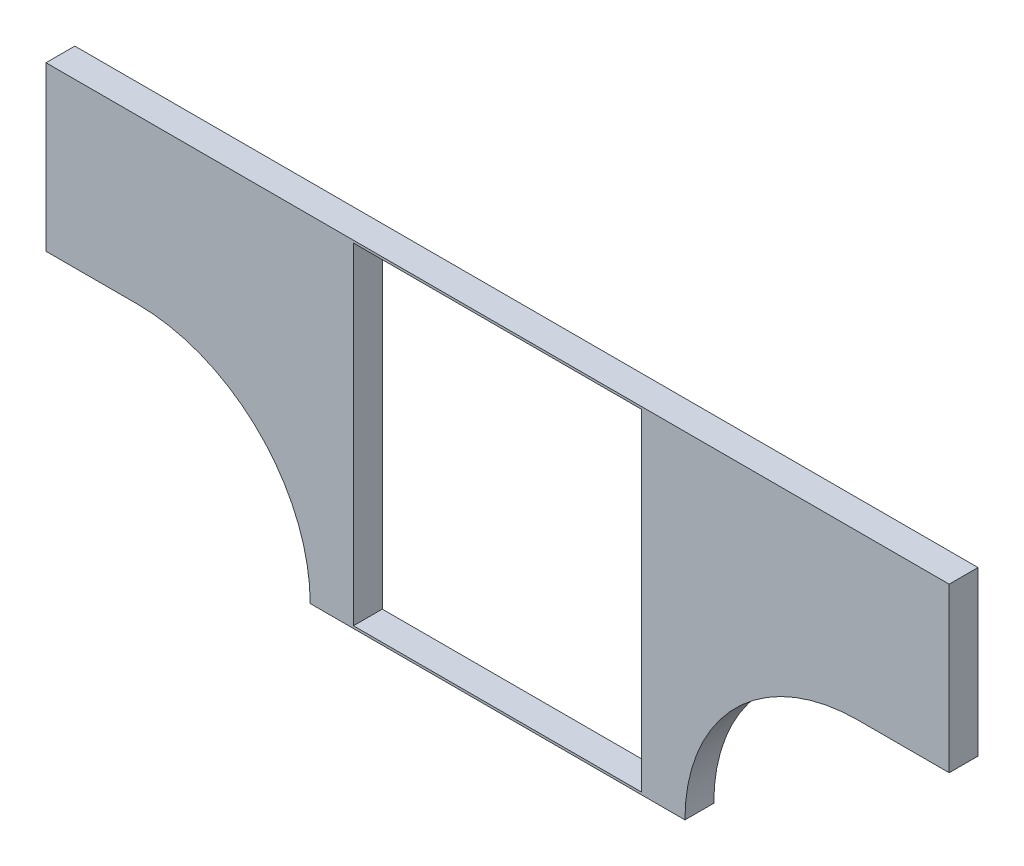
ISO-10303-21;
HEADER;
FILE_DESCRIPTION(('STEP AP214'),'2;1');
FILE_NAME('part.step','',(''),(''),'','','');
FILE_SCHEMA(('AUTOMOTIVE_DESIGN { 1 0 10303 214 1 1 1 1 }'));
ENDSEC;
DATA;
#1=APPLICATION_CONTEXT('core data for automotive mechanical design processes');
#2=APPLICATION_PROTOCOL_DEFINITION('international standard','automotive_design',2000,#1);
#3=PRODUCT_CONTEXT('',#1,'mechanical');
#4=PRODUCT('Part','Part','',(#3));
#5=PRODUCT_RELATED_PRODUCT_CATEGORY('part','',(#4));
#6=PRODUCT_DEFINITION_FORMATION('','',#4);
#7=PRODUCT_DEFINITION_CONTEXT('part definition',#1,'design');
#8=PRODUCT_DEFINITION('design','',#6,#7);
#9=PRODUCT_DEFINITION_SHAPE('','',#8);
#10=(LENGTH_UNIT() NAMED_UNIT(*) SI_UNIT(.MILLI.,.METRE.));
#11=(NAMED_UNIT(*) PLANE_ANGLE_UNIT() SI_UNIT($,.RADIAN.));
#12=(NAMED_UNIT(*) SI_UNIT($,.STERADIAN.) SOLID_ANGLE_UNIT());
#13=UNCERTAINTY_MEASURE_WITH_UNIT(LENGTH_MEASURE(1.E-05),#10,'distance_accuracy_value','');
#14=(GEOMETRIC_REPRESENTATION_CONTEXT(3) GLOBAL_UNCERTAINTY_ASSIGNED_CONTEXT((#13)) GLOBAL_UNIT_ASSIGNED_CONTEXT((#10,
#11,#12)) REPRESENTATION_CONTEXT('',''));
#15=CARTESIAN_POINT('',(0.,0.,0.));
#16=DIRECTION('',(0.,0.,1.));
#17=DIRECTION('',(1.,0.,0.));
#18=AXIS2_PLACEMENT_3D('',#15,#16,#17);
#19=CARTESIAN_POINT('',(0.,-700.,120.));
#20=DIRECTION('',(0.,1.,0.));
#21=DIRECTION('',(0.,0.,1.));
#22=AXIS2_PLACEMENT_3D('',#19,#20,#21);
#23=PLANE('',#22);
#24=DIRECTION('',(1.,0.,0.));
#25=VECTOR('',#24,1.);
#26=CARTESIAN_POINT('',(0.,-700.,0.));
#27=LINE('',#26,#25);
#28=CARTESIAN_POINT('',(-780.,-700.,0.));
#29=VERTEX_POINT('',#28);
#30=CARTESIAN_POINT('',(780.,-700.,0.));
#31=VERTEX_POINT('',#30);
#32=EDGE_CURVE('E160',#29,#31,#27,.T.);
#33=ORIENTED_EDGE('',*,*,#32,.T.);
#34=DIRECTION('',(0.,0.,-1.));
#35=VECTOR('',#34,1.);
#36=CARTESIAN_POINT('',(780.,-700.,120.));
#37=LINE('',#36,#35);
#38=CARTESIAN_POINT('',(780.,-700.,120.));
#39=VERTEX_POINT('',#38);
#40=EDGE_CURVE('E11',#39,#31,#37,.T.);
#41=ORIENTED_EDGE('',*,*,#40,.F.);
#42=DIRECTION('',(1.,0.,0.));
#43=VECTOR('',#42,1.);
#44=CARTESIAN_POINT('',(0.,-700.,120.));
#45=LINE('',#44,#43);
#46=CARTESIAN_POINT('',(-780.,-700.,120.));
#47=VERTEX_POINT('',#46);
#48=EDGE_CURVE('E164',#47,#39,#45,.T.);
#49=ORIENTED_EDGE('',*,*,#48,.F.);
#50=DIRECTION('',(0.,0.,-1.));
#51=VECTOR('',#50,1.);
#52=CARTESIAN_POINT('',(-780.,-700.,120.));
#53=LINE('',#52,#51);
#54=EDGE_CURVE('E186',#47,#29,#53,.T.);
#55=ORIENTED_EDGE('',*,*,#54,.T.);
#56=EDGE_LOOP('',(#33,#41,#49,#55));
#57=FACE_BOUND('',#56,.T.);
#58=ADVANCED_FACE('F41',(#57),#23,.F.);
#59=CARTESIAN_POINT('',(1500.,-700.,120.));
#60=DIRECTION('',(0.,0.,-1.));
#61=DIRECTION('',(-1.,0.,0.));
#62=AXIS2_PLACEMENT_3D('',#59,#60,#61);
#63=CYLINDRICAL_SURFACE('',#62,720.);
#64=CARTESIAN_POINT('',(1500.,-700.,0.));
#65=DIRECTION('',(0.,0.,1.));
#66=DIRECTION('',(1.,0.,0.));
#67=AXIS2_PLACEMENT_3D('',#64,#65,#66);
#68=CIRCLE('',#67,720.);
#69=CARTESIAN_POINT('',(1500.,20.0000000000001,0.));
#70=VERTEX_POINT('',#69);
#71=EDGE_CURVE('E189',#31,#70,#68,.F.);
#72=ORIENTED_EDGE('',*,*,#71,.T.);
#73=DIRECTION('',(0.,0.,-1.));
#74=VECTOR('',#73,1.);
#75=CARTESIAN_POINT('',(1500.,20.0000000000001,120.));
#76=LINE('',#75,#74);
#77=CARTESIAN_POINT('',(1500.,20.0000000000001,120.));
#78=VERTEX_POINT('',#77);
#79=EDGE_CURVE('E48',#78,#70,#76,.T.);
#80=ORIENTED_EDGE('',*,*,#79,.F.);
#81=CARTESIAN_POINT('',(1500.,-700.,120.));
#82=DIRECTION('',(0.,0.,1.));
#83=DIRECTION('',(1.,0.,0.));
#84=AXIS2_PLACEMENT_3D('',#81,#82,#83);
#85=CIRCLE('',#84,720.);
#86=EDGE_CURVE('E167',#39,#78,#85,.F.);
#87=ORIENTED_EDGE('',*,*,#86,.F.);
#88=ORIENTED_EDGE('',*,*,#40,.T.);
#89=EDGE_LOOP('',(#72,#80,#87,#88));
#90=FACE_BOUND('',#89,.T.);
#91=ADVANCED_FACE('F252',(#90),#63,.F.);
#92=CARTESIAN_POINT('',(0.,20.0000000000001,120.));
#93=DIRECTION('',(0.,1.,0.));
#94=DIRECTION('',(0.,0.,1.));
#95=AXIS2_PLACEMENT_3D('',#92,#93,#94);
#96=PLANE('',#95);
#97=DIRECTION('',(1.,0.,0.));
#98=VECTOR('',#97,1.);
#99=CARTESIAN_POINT('',(0.,20.0000000000001,0.));
#100=LINE('',#99,#98);
#101=CARTESIAN_POINT('',(1880.,20.0000000000001,0.));
#102=VERTEX_POINT('',#101);
#103=EDGE_CURVE('E191',#70,#102,#100,.T.);
#104=ORIENTED_EDGE('',*,*,#103,.T.);
#105=DIRECTION('',(0.,0.,-1.));
#106=VECTOR('',#105,1.);
#107=CARTESIAN_POINT('',(1880.,20.0000000000001,120.));
#108=LINE('',#107,#106);
#109=CARTESIAN_POINT('',(1880.,20.0000000000001,120.));
#110=VERTEX_POINT('',#109);
#111=EDGE_CURVE('E217',#110,#102,#108,.T.);
#112=ORIENTED_EDGE('',*,*,#111,.F.);
#113=DIRECTION('',(1.,0.,0.));
#114=VECTOR('',#113,1.);
#115=CARTESIAN_POINT('',(0.,20.0000000000001,120.));
#116=LINE('',#115,#114);
#117=EDGE_CURVE('E170',#78,#110,#116,.T.);
#118=ORIENTED_EDGE('',*,*,#117,.F.);
#119=ORIENTED_EDGE('',*,*,#79,.T.);
#120=EDGE_LOOP('',(#104,#112,#118,#119));
#121=FACE_BOUND('',#120,.T.);
#122=ADVANCED_FACE('F223',(#121),#96,.F.);
#123=CARTESIAN_POINT('',(1880.,0.,120.));
#124=DIRECTION('',(1.,0.,0.));
#125=DIRECTION('',(0.,0.,-1.));
#126=AXIS2_PLACEMENT_3D('',#123,#124,#125);
#127=PLANE('',#126);
#128=DIRECTION('',(0.,-1.,0.));
#129=VECTOR('',#128,1.);
#130=CARTESIAN_POINT('',(1880.,0.,0.));
#131=LINE('',#130,#129);
#132=CARTESIAN_POINT('',(1880.,700.,0.));
#133=VERTEX_POINT('',#132);
#134=EDGE_CURVE('E194',#133,#102,#131,.T.);
#135=ORIENTED_EDGE('',*,*,#134,.F.);
#136=DIRECTION('',(0.,0.,-1.));
#137=VECTOR('',#136,1.);
#138=CARTESIAN_POINT('',(1880.,700.,120.));
#139=LINE('',#138,#137);
#140=CARTESIAN_POINT('',(1880.,700.,120.));
#141=VERTEX_POINT('',#140);
#142=EDGE_CURVE('E215',#141,#133,#139,.T.);
#143=ORIENTED_EDGE('',*,*,#142,.F.);
#144=DIRECTION('',(0.,-1.,0.));
#145=VECTOR('',#144,1.);
#146=CARTESIAN_POINT('',(1880.,0.,120.));
#147=LINE('',#146,#145);
#148=EDGE_CURVE('E172',#141,#110,#147,.T.);
#149=ORIENTED_EDGE('',*,*,#148,.T.);
#150=ORIENTED_EDGE('',*,*,#111,.T.);
#151=EDGE_LOOP('',(#135,#143,#149,#150));
#152=FACE_BOUND('',#151,.T.);
#153=ADVANCED_FACE('F233',(#152),#127,.T.);
#154=CARTESIAN_POINT('',(0.,700.,120.));
#155=DIRECTION('',(0.,1.,0.));
#156=DIRECTION('',(0.,0.,1.));
#157=AXIS2_PLACEMENT_3D('',#154,#155,#156);
#158=PLANE('',#157);
#159=DIRECTION('',(1.,0.,0.));
#160=VECTOR('',#159,1.);
#161=CARTESIAN_POINT('',(0.,700.,0.));
#162=LINE('',#161,#160);
#163=CARTESIAN_POINT('',(-1880.,700.,0.));
#164=VERTEX_POINT('',#163);
#165=EDGE_CURVE('E197',#164,#133,#162,.T.);
#166=ORIENTED_EDGE('',*,*,#165,.F.);
#167=DIRECTION('',(0.,0.,-1.));
#168=VECTOR('',#167,1.);
#169=CARTESIAN_POINT('',(-1880.,700.,120.));
#170=LINE('',#169,#168);
#171=CARTESIAN_POINT('',(-1880.,700.,120.));
#172=VERTEX_POINT('',#171);
#173=EDGE_CURVE('E213',#172,#164,#170,.T.);
#174=ORIENTED_EDGE('',*,*,#173,.F.);
#175=DIRECTION('',(1.,0.,0.));
#176=VECTOR('',#175,1.);
#177=CARTESIAN_POINT('',(0.,700.,120.));
#178=LINE('',#177,#176);
#179=EDGE_CURVE('E175',#172,#141,#178,.T.);
#180=ORIENTED_EDGE('',*,*,#179,.T.);
#181=ORIENTED_EDGE('',*,*,#142,.T.);
#182=EDGE_LOOP('',(#166,#174,#180,#181));
#183=FACE_BOUND('',#182,.T.);
#184=ADVANCED_FACE('F237',(#183),#158,.T.);
#185=CARTESIAN_POINT('',(-1880.,0.,120.));
#186=DIRECTION('',(1.,0.,0.));
#187=DIRECTION('',(0.,0.,-1.));
#188=AXIS2_PLACEMENT_3D('',#185,#186,#187);
#189=PLANE('',#188);
#190=DIRECTION('',(0.,-1.,0.));
#191=VECTOR('',#190,1.);
#192=CARTESIAN_POINT('',(-1880.,0.,0.));
#193=LINE('',#192,#191);
#194=CARTESIAN_POINT('',(-1880.,20.0000000000001,0.));
#195=VERTEX_POINT('',#194);
#196=EDGE_CURVE('E200',#164,#195,#193,.T.);
#197=ORIENTED_EDGE('',*,*,#196,.T.);
#198=DIRECTION('',(0.,0.,-1.));
#199=VECTOR('',#198,1.);
#200=CARTESIAN_POINT('',(-1880.,20.0000000000001,120.));
#201=LINE('',#200,#199);
#202=CARTESIAN_POINT('',(-1880.,20.0000000000001,120.));
#203=VERTEX_POINT('',#202);
#204=EDGE_CURVE('E211',#203,#195,#201,.T.);
#205=ORIENTED_EDGE('',*,*,#204,.F.);
#206=DIRECTION('',(0.,-1.,0.));
#207=VECTOR('',#206,1.);
#208=CARTESIAN_POINT('',(-1880.,0.,120.));
#209=LINE('',#208,#207);
#210=EDGE_CURVE('E178',#172,#203,#209,.T.);
#211=ORIENTED_EDGE('',*,*,#210,.F.);
#212=ORIENTED_EDGE('',*,*,#173,.T.);
#213=EDGE_LOOP('',(#197,#205,#211,#212));
#214=FACE_BOUND('',#213,.T.);
#215=ADVANCED_FACE('F241',(#214),#189,.F.);
#216=CARTESIAN_POINT('',(0.,20.0000000000001,120.));
#217=DIRECTION('',(0.,-1.,0.));
#218=DIRECTION('',(0.,0.,-1.));
#219=AXIS2_PLACEMENT_3D('',#216,#217,#218);
#220=PLANE('',#219);
#221=DIRECTION('',(-1.,0.,0.));
#222=VECTOR('',#221,1.);
#223=CARTESIAN_POINT('',(0.,20.0000000000001,0.));
#224=LINE('',#223,#222);
#225=CARTESIAN_POINT('',(-1500.,20.0000000000001,0.));
#226=VERTEX_POINT('',#225);
#227=EDGE_CURVE('E203',#226,#195,#224,.T.);
#228=ORIENTED_EDGE('',*,*,#227,.F.);
#229=DIRECTION('',(0.,0.,-1.));
#230=VECTOR('',#229,1.);
#231=CARTESIAN_POINT('',(-1500.,20.0000000000001,120.));
#232=LINE('',#231,#230);
#233=CARTESIAN_POINT('',(-1500.,20.0000000000001,120.));
#234=VERTEX_POINT('',#233);
#235=EDGE_CURVE('E209',#234,#226,#232,.T.);
#236=ORIENTED_EDGE('',*,*,#235,.F.);
#237=DIRECTION('',(-1.,0.,0.));
#238=VECTOR('',#237,1.);
#239=CARTESIAN_POINT('',(0.,20.0000000000001,120.));
#240=LINE('',#239,#238);
#241=EDGE_CURVE('E180',#234,#203,#240,.T.);
#242=ORIENTED_EDGE('',*,*,#241,.T.);
#243=ORIENTED_EDGE('',*,*,#204,.T.);
#244=EDGE_LOOP('',(#228,#236,#242,#243));
#245=FACE_BOUND('',#244,.T.);
#246=ADVANCED_FACE('F253',(#245),#220,.T.);
#247=CARTESIAN_POINT('',(-1500.,-700.,120.));
#248=DIRECTION('',(0.,0.,-1.));
#249=DIRECTION('',(-1.,0.,0.));
#250=AXIS2_PLACEMENT_3D('',#247,#248,#249);
#251=CYLINDRICAL_SURFACE('',#250,720.);
#252=CARTESIAN_POINT('',(-1500.,-700.,0.));
#253=DIRECTION('',(0.,0.,1.));
#254=DIRECTION('',(1.,0.,0.));
#255=AXIS2_PLACEMENT_3D('',#252,#253,#254);
#256=CIRCLE('',#255,720.);
#257=EDGE_CURVE('E168',#29,#226,#256,.T.);
#258=ORIENTED_EDGE('',*,*,#257,.F.);
#259=ORIENTED_EDGE('',*,*,#54,.F.);
#260=CARTESIAN_POINT('',(-1500.,-700.,120.));
#261=DIRECTION('',(0.,0.,1.));
#262=DIRECTION('',(1.,0.,0.));
#263=AXIS2_PLACEMENT_3D('',#260,#261,#262);
#264=CIRCLE('',#263,720.);
#265=EDGE_CURVE('E183',#47,#234,#264,.T.);
#266=ORIENTED_EDGE('',*,*,#265,.T.);
#267=ORIENTED_EDGE('',*,*,#235,.T.);
#268=EDGE_LOOP('',(#258,#259,#266,#267));
#269=FACE_BOUND('',#268,.T.);
#270=ADVANCED_FACE('F247',(#269),#251,.F.);
#271=CARTESIAN_POINT('',(0.,0.,120.));
#272=DIRECTION('',(0.,0.,1.));
#273=DIRECTION('',(1.,0.,0.));
#274=AXIS2_PLACEMENT_3D('',#271,#272,#273);
#275=PLANE('',#274);
#276=DIRECTION('',(0.,-1.,0.));
#277=VECTOR('',#276,1.);
#278=CARTESIAN_POINT('',(600.,0.,120.));
#279=LINE('',#278,#277);
#280=CARTESIAN_POINT('',(600.,690.,120.));
#281=VERTEX_POINT('',#280);
#282=CARTESIAN_POINT('',(600.,-690.,120.));
#283=VERTEX_POINT('',#282);
#284=EDGE_CURVE('E131',#281,#283,#279,.T.);
#285=ORIENTED_EDGE('',*,*,#284,.T.);
#286=DIRECTION('',(-1.,0.,0.));
#287=VECTOR('',#286,1.);
#288=CARTESIAN_POINT('',(0.,-690.,120.));
#289=LINE('',#288,#287);
#290=CARTESIAN_POINT('',(-600.,-690.,120.));
#291=VERTEX_POINT('',#290);
#292=EDGE_CURVE('E137',#283,#291,#289,.T.);
#293=ORIENTED_EDGE('',*,*,#292,.T.);
#294=DIRECTION('',(0.,-1.,0.));
#295=VECTOR('',#294,1.);
#296=CARTESIAN_POINT('',(-600.,0.,120.));
#297=LINE('',#296,#295);
#298=CARTESIAN_POINT('',(-600.,690.,120.));
#299=VERTEX_POINT('',#298);
#300=EDGE_CURVE('E141',#299,#291,#297,.T.);
#301=ORIENTED_EDGE('',*,*,#300,.F.);
#302=DIRECTION('',(-1.,0.,0.));
#303=VECTOR('',#302,1.);
#304=CARTESIAN_POINT('',(0.,690.,120.));
#305=LINE('',#304,#303);
#306=EDGE_CURVE('E134',#281,#299,#305,.T.);
#307=ORIENTED_EDGE('',*,*,#306,.F.);
#308=EDGE_LOOP('',(#285,#293,#301,#307));
#309=FACE_BOUND('',#308,.T.);
#310=ORIENTED_EDGE('',*,*,#48,.T.);
#311=ORIENTED_EDGE('',*,*,#86,.T.);
#312=ORIENTED_EDGE('',*,*,#117,.T.);
#313=ORIENTED_EDGE('',*,*,#148,.F.);
#314=ORIENTED_EDGE('',*,*,#179,.F.);
#315=ORIENTED_EDGE('',*,*,#210,.T.);
#316=ORIENTED_EDGE('',*,*,#241,.F.);
#317=ORIENTED_EDGE('',*,*,#265,.F.);
#318=EDGE_LOOP('',(#310,#311,#312,#313,#314,#315,#316,#317));
#319=FACE_BOUND('',#318,.T.);
#320=ADVANCED_FACE('F143',(#309,#319),#275,.T.);
#321=CARTESIAN_POINT('',(0.,0.,0.));
#322=DIRECTION('',(0.,0.,1.));
#323=DIRECTION('',(1.,0.,0.));
#324=AXIS2_PLACEMENT_3D('',#321,#322,#323);
#325=PLANE('',#324);
#326=DIRECTION('',(-1.,0.,0.));
#327=VECTOR('',#326,1.);
#328=CARTESIAN_POINT('',(0.,-690.,0.));
#329=LINE('',#328,#327);
#330=CARTESIAN_POINT('',(600.,-690.,0.));
#331=VERTEX_POINT('',#330);
#332=CARTESIAN_POINT('',(-600.,-690.,0.));
#333=VERTEX_POINT('',#332);
#334=EDGE_CURVE('E154',#331,#333,#329,.T.);
#335=ORIENTED_EDGE('',*,*,#334,.F.);
#336=DIRECTION('',(0.,-1.,0.));
#337=VECTOR('',#336,1.);
#338=CARTESIAN_POINT('',(600.,0.,0.));
#339=LINE('',#338,#337);
#340=CARTESIAN_POINT('',(600.,690.,0.));
#341=VERTEX_POINT('',#340);
#342=EDGE_CURVE('E63',#341,#331,#339,.T.);
#343=ORIENTED_EDGE('',*,*,#342,.F.);
#344=DIRECTION('',(-1.,0.,0.));
#345=VECTOR('',#344,1.);
#346=CARTESIAN_POINT('',(0.,690.,0.));
#347=LINE('',#346,#345);
#348=CARTESIAN_POINT('',(-600.,690.,0.));
#349=VERTEX_POINT('',#348);
#350=EDGE_CURVE('E145',#341,#349,#347,.T.);
#351=ORIENTED_EDGE('',*,*,#350,.T.);
#352=DIRECTION('',(0.,-1.,0.));
#353=VECTOR('',#352,1.);
#354=CARTESIAN_POINT('',(-600.,0.,0.));
#355=LINE('',#354,#353);
#356=EDGE_CURVE('E148',#349,#333,#355,.T.);
#357=ORIENTED_EDGE('',*,*,#356,.T.);
#358=EDGE_LOOP('',(#335,#343,#351,#357));
#359=FACE_BOUND('',#358,.T.);
#360=ORIENTED_EDGE('',*,*,#32,.F.);
#361=ORIENTED_EDGE('',*,*,#257,.T.);
#362=ORIENTED_EDGE('',*,*,#227,.T.);
#363=ORIENTED_EDGE('',*,*,#196,.F.);
#364=ORIENTED_EDGE('',*,*,#165,.T.);
#365=ORIENTED_EDGE('',*,*,#134,.T.);
#366=ORIENTED_EDGE('',*,*,#103,.F.);
#367=ORIENTED_EDGE('',*,*,#71,.F.);
#368=EDGE_LOOP('',(#360,#361,#362,#363,#364,#365,#366,#367));
#369=FACE_BOUND('',#368,.T.);
#370=ADVANCED_FACE('F228',(#359,#369),#325,.F.);
#371=CARTESIAN_POINT('',(600.,0.,120.));
#372=DIRECTION('',(1.,0.,0.));
#373=DIRECTION('',(0.,1.,0.));
#374=AXIS2_PLACEMENT_3D('',#371,#372,#373);
#375=PLANE('',#374);
#376=ORIENTED_EDGE('',*,*,#342,.T.);
#377=DIRECTION('',(0.,0.,-1.));
#378=VECTOR('',#377,1.);
#379=CARTESIAN_POINT('',(600.,-690.,120.));
#380=LINE('',#379,#378);
#381=EDGE_CURVE('E128',#283,#331,#380,.T.);
#382=ORIENTED_EDGE('',*,*,#381,.F.);
#383=ORIENTED_EDGE('',*,*,#284,.F.);
#384=DIRECTION('',(0.,0.,-1.));
#385=VECTOR('',#384,1.);
#386=CARTESIAN_POINT('',(600.,690.,120.));
#387=LINE('',#386,#385);
#388=EDGE_CURVE('E158',#281,#341,#387,.T.);
#389=ORIENTED_EDGE('',*,*,#388,.T.);
#390=EDGE_LOOP('',(#376,#382,#383,#389));
#391=FACE_BOUND('',#390,.T.);
#392=ADVANCED_FACE('F129',(#391),#375,.F.);
#393=CARTESIAN_POINT('',(0.,690.,120.));
#394=DIRECTION('',(0.,-1.,0.));
#395=DIRECTION('',(0.,0.,-1.));
#396=AXIS2_PLACEMENT_3D('',#393,#394,#395);
#397=PLANE('',#396);
#398=ORIENTED_EDGE('',*,*,#350,.F.);
#399=ORIENTED_EDGE('',*,*,#388,.F.);
#400=ORIENTED_EDGE('',*,*,#306,.T.);
#401=DIRECTION('',(0.,0.,-1.));
#402=VECTOR('',#401,1.);
#403=CARTESIAN_POINT('',(-600.,690.,120.));
#404=LINE('',#403,#402);
#405=EDGE_CURVE('E161',#299,#349,#404,.T.);
#406=ORIENTED_EDGE('',*,*,#405,.T.);
#407=EDGE_LOOP('',(#398,#399,#400,#406));
#408=FACE_BOUND('',#407,.T.);
#409=ADVANCED_FACE('F319',(#408),#397,.T.);
#410=CARTESIAN_POINT('',(-600.,0.,120.));
#411=DIRECTION('',(1.,0.,0.));
#412=DIRECTION('',(0.,1.,0.));
#413=AXIS2_PLACEMENT_3D('',#410,#411,#412);
#414=PLANE('',#413);
#415=ORIENTED_EDGE('',*,*,#356,.F.);
#416=ORIENTED_EDGE('',*,*,#405,.F.);
#417=ORIENTED_EDGE('',*,*,#300,.T.);
#418=DIRECTION('',(0.,0.,-1.));
#419=VECTOR('',#418,1.);
#420=CARTESIAN_POINT('',(-600.,-690.,120.));
#421=LINE('',#420,#419);
#422=EDGE_CURVE('E55',#291,#333,#421,.T.);
#423=ORIENTED_EDGE('',*,*,#422,.T.);
#424=EDGE_LOOP('',(#415,#416,#417,#423));
#425=FACE_BOUND('',#424,.T.);
#426=ADVANCED_FACE('F328',(#425),#414,.T.);
#427=CARTESIAN_POINT('',(0.,-690.,120.));
#428=DIRECTION('',(0.,-1.,0.));
#429=DIRECTION('',(0.,0.,-1.));
#430=AXIS2_PLACEMENT_3D('',#427,#428,#429);
#431=PLANE('',#430);
#432=ORIENTED_EDGE('',*,*,#334,.T.);
#433=ORIENTED_EDGE('',*,*,#422,.F.);
#434=ORIENTED_EDGE('',*,*,#292,.F.);
#435=ORIENTED_EDGE('',*,*,#381,.T.);
#436=EDGE_LOOP('',(#432,#433,#434,#435));
#437=FACE_BOUND('',#436,.T.);
#438=ADVANCED_FACE('F138',(#437),#431,.F.);
#439=CLOSED_SHELL('',(#58,#91,#122,#153,#184,#215,#246,#270,#320,#370,#392,#409,#426,#438));
#440=MANIFOLD_SOLID_BREP('B2',#439);
#441=ADVANCED_BREP_SHAPE_REPRESENTATION('',(#18,#440),#14);
#442=SHAPE_DEFINITION_REPRESENTATION(#9,#441);
ENDSEC;
END-ISO-10303-21;
